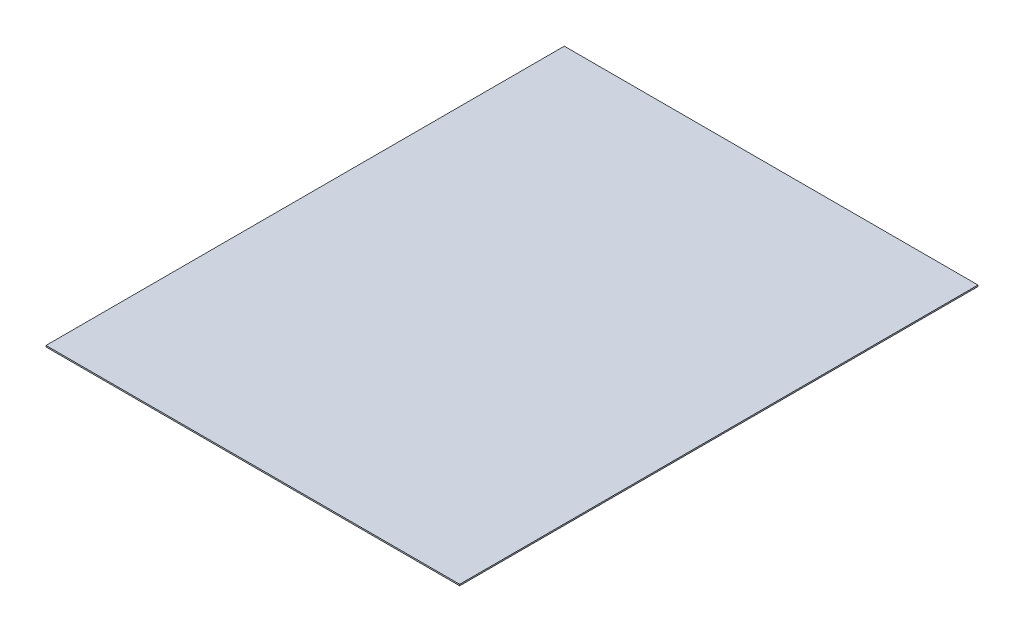
ISO-10303-21;
HEADER;
FILE_DESCRIPTION(('STEP AP214'),'2;1');
FILE_NAME('part.step','',(''),(''),'','','');
FILE_SCHEMA(('AUTOMOTIVE_DESIGN { 1 0 10303 214 1 1 1 1 }'));
ENDSEC;
DATA;
#1=APPLICATION_CONTEXT('core data for automotive mechanical design processes');
#2=APPLICATION_PROTOCOL_DEFINITION('international standard','automotive_design',2000,#1);
#3=PRODUCT_CONTEXT('',#1,'mechanical');
#4=PRODUCT('Part','Part','',(#3));
#5=PRODUCT_RELATED_PRODUCT_CATEGORY('part','',(#4));
#6=PRODUCT_DEFINITION_FORMATION('','',#4);
#7=PRODUCT_DEFINITION_CONTEXT('part definition',#1,'design');
#8=PRODUCT_DEFINITION('design','',#6,#7);
#9=PRODUCT_DEFINITION_SHAPE('','',#8);
#10=(LENGTH_UNIT() NAMED_UNIT(*) SI_UNIT(.MILLI.,.METRE.));
#11=(NAMED_UNIT(*) PLANE_ANGLE_UNIT() SI_UNIT($,.RADIAN.));
#12=(NAMED_UNIT(*) SI_UNIT($,.STERADIAN.) SOLID_ANGLE_UNIT());
#13=UNCERTAINTY_MEASURE_WITH_UNIT(LENGTH_MEASURE(1.E-05),#10,'distance_accuracy_value','');
#14=(GEOMETRIC_REPRESENTATION_CONTEXT(3) GLOBAL_UNCERTAINTY_ASSIGNED_CONTEXT((#13)) GLOBAL_UNIT_ASSIGNED_CONTEXT((#10,
#11,#12)) REPRESENTATION_CONTEXT('',''));
#15=CARTESIAN_POINT('',(0.,0.,0.));
#16=DIRECTION('',(0.,0.,1.));
#17=DIRECTION('',(1.,0.,0.));
#18=AXIS2_PLACEMENT_3D('',#15,#16,#17);
#19=CARTESIAN_POINT('',(0.,-22.5409296281501,26.5761341949671));
#20=DIRECTION('',(-1.,0.,0.));
#21=DIRECTION('',(0.,0.,-1.));
#22=AXIS2_PLACEMENT_3D('',#19,#20,#21);
#23=PLANE('',#22);
#24=DIRECTION('',(0.,-1.,0.));
#25=VECTOR('',#24,1.);
#26=CARTESIAN_POINT('',(0.,-22.5409296281501,26.5761341949671));
#27=LINE('',#26,#25);
#28=CARTESIAN_POINT('',(0.,-22.4409296281501,26.5761341949671));
#29=VERTEX_POINT('',#28);
#30=CARTESIAN_POINT('',(0.,-22.5409296281501,26.5761341949671));
#31=VERTEX_POINT('',#30);
#32=EDGE_CURVE('E11',#29,#31,#27,.T.);
#33=ORIENTED_EDGE('',*,*,#32,.F.);
#34=DIRECTION('',(0.,0.,-1.));
#35=VECTOR('',#34,1.);
#36=CARTESIAN_POINT('',(0.,-22.4409296281501,26.5761341949671));
#37=LINE('',#36,#35);
#38=CARTESIAN_POINT('',(0.,-22.4409296281501,-11.0115706364692));
#39=VERTEX_POINT('',#38);
#40=EDGE_CURVE('E88',#29,#39,#37,.T.);
#41=ORIENTED_EDGE('',*,*,#40,.T.);
#42=DIRECTION('',(0.,-1.,0.));
#43=VECTOR('',#42,1.);
#44=CARTESIAN_POINT('',(0.,-22.5409296281501,-11.0115706364692));
#45=LINE('',#44,#43);
#46=CARTESIAN_POINT('',(0.,-22.5409296281501,-11.0115706364692));
#47=VERTEX_POINT('',#46);
#48=EDGE_CURVE('E43',#39,#47,#45,.T.);
#49=ORIENTED_EDGE('',*,*,#48,.T.);
#50=DIRECTION('',(0.,0.,-1.));
#51=VECTOR('',#50,1.);
#52=CARTESIAN_POINT('',(0.,-22.5409296281501,26.5761341949671));
#53=LINE('',#52,#51);
#54=EDGE_CURVE('E101',#31,#47,#53,.T.);
#55=ORIENTED_EDGE('',*,*,#54,.F.);
#56=EDGE_LOOP('',(#33,#41,#49,#55));
#57=FACE_BOUND('',#56,.T.);
#58=ADVANCED_FACE('F33',(#57),#23,.T.);
#59=CARTESIAN_POINT('',(0.,-22.5409296281501,-11.0115706364692));
#60=DIRECTION('',(0.,0.,-1.));
#61=DIRECTION('',(1.,0.,0.));
#62=AXIS2_PLACEMENT_3D('',#59,#60,#61);
#63=PLANE('',#62);
#64=ORIENTED_EDGE('',*,*,#48,.F.);
#65=DIRECTION('',(1.,0.,0.));
#66=VECTOR('',#65,1.);
#67=CARTESIAN_POINT('',(0.,-22.4409296281501,-11.0115706364692));
#68=LINE('',#67,#66);
#69=CARTESIAN_POINT('',(30.,-22.4409296281501,-11.0115706364692));
#70=VERTEX_POINT('',#69);
#71=EDGE_CURVE('E95',#39,#70,#68,.T.);
#72=ORIENTED_EDGE('',*,*,#71,.T.);
#73=DIRECTION('',(0.,-1.,0.));
#74=VECTOR('',#73,1.);
#75=CARTESIAN_POINT('',(30.,-22.5409296281501,-11.0115706364692));
#76=LINE('',#75,#74);
#77=CARTESIAN_POINT('',(30.,-22.5409296281501,-11.0115706364692));
#78=VERTEX_POINT('',#77);
#79=EDGE_CURVE('E51',#70,#78,#76,.T.);
#80=ORIENTED_EDGE('',*,*,#79,.T.);
#81=DIRECTION('',(1.,0.,0.));
#82=VECTOR('',#81,1.);
#83=CARTESIAN_POINT('',(0.,-22.5409296281501,-11.0115706364692));
#84=LINE('',#83,#82);
#85=EDGE_CURVE('E82',#47,#78,#84,.T.);
#86=ORIENTED_EDGE('',*,*,#85,.F.);
#87=EDGE_LOOP('',(#64,#72,#80,#86));
#88=FACE_BOUND('',#87,.T.);
#89=ADVANCED_FACE('F105',(#88),#63,.T.);
#90=CARTESIAN_POINT('',(30.,-22.5409296281501,26.5761341949671));
#91=DIRECTION('',(-1.,0.,0.));
#92=DIRECTION('',(0.,0.,-1.));
#93=AXIS2_PLACEMENT_3D('',#90,#91,#92);
#94=PLANE('',#93);
#95=ORIENTED_EDGE('',*,*,#79,.F.);
#96=DIRECTION('',(0.,0.,-1.));
#97=VECTOR('',#96,1.);
#98=CARTESIAN_POINT('',(30.,-22.4409296281501,26.5761341949671));
#99=LINE('',#98,#97);
#100=CARTESIAN_POINT('',(30.,-22.4409296281501,26.5761341949671));
#101=VERTEX_POINT('',#100);
#102=EDGE_CURVE('E87',#101,#70,#99,.T.);
#103=ORIENTED_EDGE('',*,*,#102,.F.);
#104=DIRECTION('',(0.,-1.,0.));
#105=VECTOR('',#104,1.);
#106=CARTESIAN_POINT('',(30.,-22.5409296281501,26.5761341949671));
#107=LINE('',#106,#105);
#108=CARTESIAN_POINT('',(30.,-22.5409296281501,26.5761341949671));
#109=VERTEX_POINT('',#108);
#110=EDGE_CURVE('E37',#101,#109,#107,.T.);
#111=ORIENTED_EDGE('',*,*,#110,.T.);
#112=DIRECTION('',(0.,0.,-1.));
#113=VECTOR('',#112,1.);
#114=CARTESIAN_POINT('',(30.,-22.5409296281501,26.5761341949671));
#115=LINE('',#114,#113);
#116=EDGE_CURVE('E97',#109,#78,#115,.T.);
#117=ORIENTED_EDGE('',*,*,#116,.T.);
#118=EDGE_LOOP('',(#95,#103,#111,#117));
#119=FACE_BOUND('',#118,.T.);
#120=ADVANCED_FACE('F90',(#119),#94,.F.);
#121=CARTESIAN_POINT('',(0.,-22.5409296281501,26.5761341949671));
#122=DIRECTION('',(0.,0.,-1.));
#123=DIRECTION('',(1.,0.,0.));
#124=AXIS2_PLACEMENT_3D('',#121,#122,#123);
#125=PLANE('',#124);
#126=DIRECTION('',(1.,0.,0.));
#127=VECTOR('',#126,1.);
#128=CARTESIAN_POINT('',(0.,-22.4409296281501,26.5761341949671));
#129=LINE('',#128,#127);
#130=EDGE_CURVE('E76',#29,#101,#129,.T.);
#131=ORIENTED_EDGE('',*,*,#130,.F.);
#132=ORIENTED_EDGE('',*,*,#32,.T.);
#133=DIRECTION('',(1.,0.,0.));
#134=VECTOR('',#133,1.);
#135=CARTESIAN_POINT('',(0.,-22.5409296281501,26.5761341949671));
#136=LINE('',#135,#134);
#137=EDGE_CURVE('E78',#31,#109,#136,.T.);
#138=ORIENTED_EDGE('',*,*,#137,.T.);
#139=ORIENTED_EDGE('',*,*,#110,.F.);
#140=EDGE_LOOP('',(#131,#132,#138,#139));
#141=FACE_BOUND('',#140,.T.);
#142=ADVANCED_FACE('F35',(#141),#125,.F.);
#143=CARTESIAN_POINT('',(0.,-22.5409296281501,26.5761341949671));
#144=DIRECTION('',(0.,-1.,0.));
#145=DIRECTION('',(0.,0.,-1.));
#146=AXIS2_PLACEMENT_3D('',#143,#144,#145);
#147=PLANE('',#146);
#148=ORIENTED_EDGE('',*,*,#116,.F.);
#149=ORIENTED_EDGE('',*,*,#137,.F.);
#150=ORIENTED_EDGE('',*,*,#54,.T.);
#151=ORIENTED_EDGE('',*,*,#85,.T.);
#152=EDGE_LOOP('',(#148,#149,#150,#151));
#153=FACE_BOUND('',#152,.T.);
#154=ADVANCED_FACE('F104',(#153),#147,.T.);
#155=CARTESIAN_POINT('',(0.,-22.4409296281501,26.5761341949671));
#156=DIRECTION('',(0.,-1.,0.));
#157=DIRECTION('',(0.,0.,-1.));
#158=AXIS2_PLACEMENT_3D('',#155,#156,#157);
#159=PLANE('',#158);
#160=ORIENTED_EDGE('',*,*,#102,.T.);
#161=ORIENTED_EDGE('',*,*,#71,.F.);
#162=ORIENTED_EDGE('',*,*,#40,.F.);
#163=ORIENTED_EDGE('',*,*,#130,.T.);
#164=EDGE_LOOP('',(#160,#161,#162,#163));
#165=FACE_BOUND('',#164,.T.);
#166=ADVANCED_FACE('F85',(#165),#159,.F.);
#167=CLOSED_SHELL('',(#58,#89,#120,#142,#154,#166));
#168=MANIFOLD_SOLID_BREP('B2',#167);
#169=ADVANCED_BREP_SHAPE_REPRESENTATION('',(#18,#168),#14);
#170=SHAPE_DEFINITION_REPRESENTATION(#9,#169);
ENDSEC;
END-ISO-10303-21;
